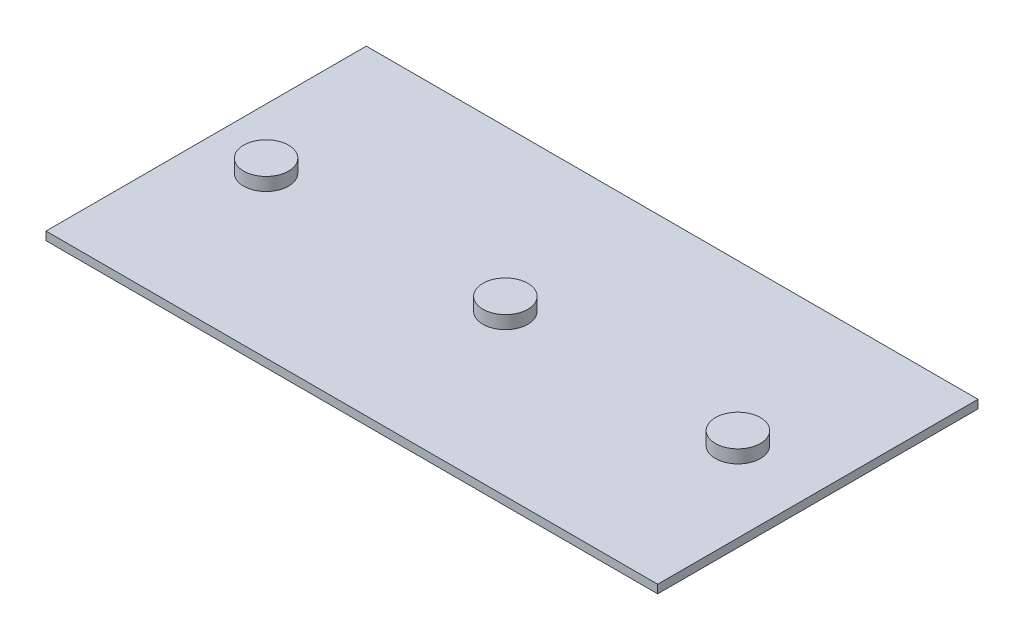
ISO-10303-21;
HEADER;
FILE_DESCRIPTION(('STEP AP214'),'2;1');
FILE_NAME('part.step','',(''),(''),'','','');
FILE_SCHEMA(('AUTOMOTIVE_DESIGN { 1 0 10303 214 1 1 1 1 }'));
ENDSEC;
DATA;
#1=APPLICATION_CONTEXT('core data for automotive mechanical design processes');
#2=APPLICATION_PROTOCOL_DEFINITION('international standard','automotive_design',2000,#1);
#3=PRODUCT_CONTEXT('',#1,'mechanical');
#4=PRODUCT('Part','Part','',(#3));
#5=PRODUCT_RELATED_PRODUCT_CATEGORY('part','',(#4));
#6=PRODUCT_DEFINITION_FORMATION('','',#4);
#7=PRODUCT_DEFINITION_CONTEXT('part definition',#1,'design');
#8=PRODUCT_DEFINITION('design','',#6,#7);
#9=PRODUCT_DEFINITION_SHAPE('','',#8);
#10=(LENGTH_UNIT() NAMED_UNIT(*) SI_UNIT(.MILLI.,.METRE.));
#11=(NAMED_UNIT(*) PLANE_ANGLE_UNIT() SI_UNIT($,.RADIAN.));
#12=(NAMED_UNIT(*) SI_UNIT($,.STERADIAN.) SOLID_ANGLE_UNIT());
#13=UNCERTAINTY_MEASURE_WITH_UNIT(LENGTH_MEASURE(1.E-05),#10,'distance_accuracy_value','');
#14=(GEOMETRIC_REPRESENTATION_CONTEXT(3) GLOBAL_UNCERTAINTY_ASSIGNED_CONTEXT((#13)) GLOBAL_UNIT_ASSIGNED_CONTEXT((#10,
#11,#12)) REPRESENTATION_CONTEXT('',''));
#15=CARTESIAN_POINT('',(0.,0.,0.));
#16=DIRECTION('',(0.,0.,1.));
#17=DIRECTION('',(1.,0.,0.));
#18=AXIS2_PLACEMENT_3D('',#15,#16,#17);
#19=CARTESIAN_POINT('',(0.,0.,0.));
#20=DIRECTION('',(0.,1.,0.));
#21=DIRECTION('',(0.,0.,1.));
#22=AXIS2_PLACEMENT_3D('',#19,#20,#21);
#23=PLANE('',#22);
#24=DIRECTION('',(0.,0.,1.));
#25=VECTOR('',#24,1.);
#26=CARTESIAN_POINT('',(0.,0.,0.));
#27=LINE('',#26,#25);
#28=CARTESIAN_POINT('',(0.,0.,0.));
#29=VERTEX_POINT('',#28);
#30=CARTESIAN_POINT('',(0.,0.,61.3));
#31=VERTEX_POINT('',#30);
#32=EDGE_CURVE('E135',#29,#31,#27,.T.);
#33=ORIENTED_EDGE('',*,*,#32,.F.);
#34=DIRECTION('',(-1.,0.,0.));
#35=VECTOR('',#34,1.);
#36=CARTESIAN_POINT('',(0.,0.,0.));
#37=LINE('',#36,#35);
#38=CARTESIAN_POINT('',(117.07,0.,0.));
#39=VERTEX_POINT('',#38);
#40=EDGE_CURVE('E153',#39,#29,#37,.T.);
#41=ORIENTED_EDGE('',*,*,#40,.F.);
#42=DIRECTION('',(0.,0.,-1.));
#43=VECTOR('',#42,1.);
#44=CARTESIAN_POINT('',(117.07,0.,0.));
#45=LINE('',#44,#43);
#46=CARTESIAN_POINT('',(117.07,0.,61.3));
#47=VERTEX_POINT('',#46);
#48=EDGE_CURVE('E165',#47,#39,#45,.T.);
#49=ORIENTED_EDGE('',*,*,#48,.F.);
#50=DIRECTION('',(1.,0.,0.));
#51=VECTOR('',#50,1.);
#52=CARTESIAN_POINT('',(0.,0.,61.3));
#53=LINE('',#52,#51);
#54=EDGE_CURVE('E142',#31,#47,#53,.T.);
#55=ORIENTED_EDGE('',*,*,#54,.F.);
#56=EDGE_LOOP('',(#33,#41,#49,#55));
#57=FACE_BOUND('',#56,.T.);
#58=DIRECTION('',(0.,0.,-1.));
#59=VECTOR('',#58,1.);
#60=CARTESIAN_POINT('',(94.07,0.,38.6));
#61=LINE('',#60,#59);
#62=CARTESIAN_POINT('',(94.07,0.,38.6));
#63=VERTEX_POINT('',#62);
#64=CARTESIAN_POINT('',(94.07,0.,23.));
#65=VERTEX_POINT('',#64);
#66=EDGE_CURVE('E133',#63,#65,#61,.T.);
#67=ORIENTED_EDGE('',*,*,#66,.F.);
#68=DIRECTION('',(-1.,0.,0.));
#69=VECTOR('',#68,1.);
#70=CARTESIAN_POINT('',(94.07,0.,38.6));
#71=LINE('',#70,#69);
#72=CARTESIAN_POINT('',(109.07,0.,38.6));
#73=VERTEX_POINT('',#72);
#74=EDGE_CURVE('E130',#73,#63,#71,.T.);
#75=ORIENTED_EDGE('',*,*,#74,.F.);
#76=DIRECTION('',(0.,0.,1.));
#77=VECTOR('',#76,1.);
#78=CARTESIAN_POINT('',(109.07,0.,38.6));
#79=LINE('',#78,#77);
#80=CARTESIAN_POINT('',(109.07,0.,23.));
#81=VERTEX_POINT('',#80);
#82=EDGE_CURVE('E66',#81,#73,#79,.T.);
#83=ORIENTED_EDGE('',*,*,#82,.F.);
#84=DIRECTION('',(1.,0.,0.));
#85=VECTOR('',#84,1.);
#86=CARTESIAN_POINT('',(94.07,0.,23.));
#87=LINE('',#86,#85);
#88=EDGE_CURVE('E61',#65,#81,#87,.T.);
#89=ORIENTED_EDGE('',*,*,#88,.F.);
#90=EDGE_LOOP('',(#67,#75,#83,#89));
#91=FACE_BOUND('',#90,.T.);
#92=ADVANCED_FACE('F45',(#57,#91),#23,.F.);
#93=CARTESIAN_POINT('',(0.,1.6,0.));
#94=DIRECTION('',(1.,0.,0.));
#95=DIRECTION('',(0.,0.,-1.));
#96=AXIS2_PLACEMENT_3D('',#93,#94,#95);
#97=PLANE('',#96);
#98=ORIENTED_EDGE('',*,*,#32,.T.);
#99=DIRECTION('',(0.,-1.,0.));
#100=VECTOR('',#99,1.);
#101=CARTESIAN_POINT('',(0.,1.6,61.3));
#102=LINE('',#101,#100);
#103=CARTESIAN_POINT('',(0.,1.6,61.3));
#104=VERTEX_POINT('',#103);
#105=EDGE_CURVE('E11',#104,#31,#102,.T.);
#106=ORIENTED_EDGE('',*,*,#105,.F.);
#107=DIRECTION('',(0.,0.,1.));
#108=VECTOR('',#107,1.);
#109=CARTESIAN_POINT('',(0.,1.6,0.));
#110=LINE('',#109,#108);
#111=CARTESIAN_POINT('',(0.,1.6,0.));
#112=VERTEX_POINT('',#111);
#113=EDGE_CURVE('E148',#112,#104,#110,.T.);
#114=ORIENTED_EDGE('',*,*,#113,.F.);
#115=DIRECTION('',(0.,-1.,0.));
#116=VECTOR('',#115,1.);
#117=CARTESIAN_POINT('',(0.,1.6,0.));
#118=LINE('',#117,#116);
#119=EDGE_CURVE('E161',#112,#29,#118,.T.);
#120=ORIENTED_EDGE('',*,*,#119,.T.);
#121=EDGE_LOOP('',(#98,#106,#114,#120));
#122=FACE_BOUND('',#121,.T.);
#123=ADVANCED_FACE('F47',(#122),#97,.F.);
#124=CARTESIAN_POINT('',(0.,1.6,61.3));
#125=DIRECTION('',(0.,0.,-1.));
#126=DIRECTION('',(-1.,0.,0.));
#127=AXIS2_PLACEMENT_3D('',#124,#125,#126);
#128=PLANE('',#127);
#129=ORIENTED_EDGE('',*,*,#54,.T.);
#130=DIRECTION('',(0.,-1.,0.));
#131=VECTOR('',#130,1.);
#132=CARTESIAN_POINT('',(117.07,1.6,61.3));
#133=LINE('',#132,#131);
#134=CARTESIAN_POINT('',(117.07,1.6,61.3));
#135=VERTEX_POINT('',#134);
#136=EDGE_CURVE('E54',#135,#47,#133,.T.);
#137=ORIENTED_EDGE('',*,*,#136,.F.);
#138=DIRECTION('',(1.,0.,0.));
#139=VECTOR('',#138,1.);
#140=CARTESIAN_POINT('',(0.,1.6,61.3));
#141=LINE('',#140,#139);
#142=EDGE_CURVE('E152',#104,#135,#141,.T.);
#143=ORIENTED_EDGE('',*,*,#142,.F.);
#144=ORIENTED_EDGE('',*,*,#105,.T.);
#145=EDGE_LOOP('',(#129,#137,#143,#144));
#146=FACE_BOUND('',#145,.T.);
#147=ADVANCED_FACE('F199',(#146),#128,.F.);
#148=CARTESIAN_POINT('',(117.07,1.6,0.));
#149=DIRECTION('',(-1.,0.,0.));
#150=DIRECTION('',(0.,0.,1.));
#151=AXIS2_PLACEMENT_3D('',#148,#149,#150);
#152=PLANE('',#151);
#153=ORIENTED_EDGE('',*,*,#48,.T.);
#154=DIRECTION('',(0.,-1.,0.));
#155=VECTOR('',#154,1.);
#156=CARTESIAN_POINT('',(117.07,1.6,0.));
#157=LINE('',#156,#155);
#158=CARTESIAN_POINT('',(117.07,1.6,0.));
#159=VERTEX_POINT('',#158);
#160=EDGE_CURVE('E173',#159,#39,#157,.T.);
#161=ORIENTED_EDGE('',*,*,#160,.F.);
#162=DIRECTION('',(0.,0.,-1.));
#163=VECTOR('',#162,1.);
#164=CARTESIAN_POINT('',(117.07,1.6,0.));
#165=LINE('',#164,#163);
#166=EDGE_CURVE('E156',#135,#159,#165,.T.);
#167=ORIENTED_EDGE('',*,*,#166,.F.);
#168=ORIENTED_EDGE('',*,*,#136,.T.);
#169=EDGE_LOOP('',(#153,#161,#167,#168));
#170=FACE_BOUND('',#169,.T.);
#171=ADVANCED_FACE('F184',(#170),#152,.F.);
#172=CARTESIAN_POINT('',(0.,1.6,0.));
#173=DIRECTION('',(0.,0.,1.));
#174=DIRECTION('',(1.,0.,0.));
#175=AXIS2_PLACEMENT_3D('',#172,#173,#174);
#176=PLANE('',#175);
#177=ORIENTED_EDGE('',*,*,#40,.T.);
#178=ORIENTED_EDGE('',*,*,#119,.F.);
#179=DIRECTION('',(-1.,0.,0.));
#180=VECTOR('',#179,1.);
#181=CARTESIAN_POINT('',(0.,1.6,0.));
#182=LINE('',#181,#180);
#183=EDGE_CURVE('E159',#159,#112,#182,.T.);
#184=ORIENTED_EDGE('',*,*,#183,.F.);
#185=ORIENTED_EDGE('',*,*,#160,.T.);
#186=EDGE_LOOP('',(#177,#178,#184,#185));
#187=FACE_BOUND('',#186,.T.);
#188=ADVANCED_FACE('F192',(#187),#176,.F.);
#189=CARTESIAN_POINT('',(0.,1.6,0.));
#190=DIRECTION('',(0.,1.,0.));
#191=DIRECTION('',(0.,0.,1.));
#192=AXIS2_PLACEMENT_3D('',#189,#190,#191);
#193=PLANE('',#192);
#194=CARTESIAN_POINT('',(11.47,1.6,30.65));
#195=DIRECTION('',(0.,1.,0.));
#196=DIRECTION('',(0.,0.,1.));
#197=AXIS2_PLACEMENT_3D('',#194,#195,#196);
#198=CIRCLE('',#197,4.3);
#199=CARTESIAN_POINT('',(11.47,1.6,34.95));
#200=VERTEX_POINT('',#199);
#201=EDGE_CURVE('E224',#200,#200,#198,.T.);
#202=ORIENTED_EDGE('',*,*,#201,.F.);
#203=EDGE_LOOP('',(#202));
#204=FACE_BOUND('',#203,.T.);
#205=CARTESIAN_POINT('',(57.27,1.6,30.65));
#206=DIRECTION('',(0.,1.,0.));
#207=DIRECTION('',(0.,0.,1.));
#208=AXIS2_PLACEMENT_3D('',#205,#206,#207);
#209=CIRCLE('',#208,4.3);
#210=CARTESIAN_POINT('',(57.27,1.6,34.95));
#211=VERTEX_POINT('',#210);
#212=EDGE_CURVE('E228',#211,#211,#209,.T.);
#213=ORIENTED_EDGE('',*,*,#212,.F.);
#214=EDGE_LOOP('',(#213));
#215=FACE_BOUND('',#214,.T.);
#216=CARTESIAN_POINT('',(101.77,1.6,30.65));
#217=DIRECTION('',(0.,1.,0.));
#218=DIRECTION('',(0.,0.,1.));
#219=AXIS2_PLACEMENT_3D('',#216,#217,#218);
#220=CIRCLE('',#219,4.3);
#221=CARTESIAN_POINT('',(101.77,1.6,34.95));
#222=VERTEX_POINT('',#221);
#223=EDGE_CURVE('E231',#222,#222,#220,.T.);
#224=ORIENTED_EDGE('',*,*,#223,.F.);
#225=EDGE_LOOP('',(#224));
#226=FACE_BOUND('',#225,.T.);
#227=ORIENTED_EDGE('',*,*,#113,.T.);
#228=ORIENTED_EDGE('',*,*,#142,.T.);
#229=ORIENTED_EDGE('',*,*,#166,.T.);
#230=ORIENTED_EDGE('',*,*,#183,.T.);
#231=EDGE_LOOP('',(#227,#228,#229,#230));
#232=FACE_BOUND('',#231,.T.);
#233=ADVANCED_FACE('F198',(#204,#215,#226,#232),#193,.T.);
#234=CARTESIAN_POINT('',(94.07,-4.,38.6));
#235=DIRECTION('',(1.,0.,0.));
#236=DIRECTION('',(0.,0.,-1.));
#237=AXIS2_PLACEMENT_3D('',#234,#235,#236);
#238=PLANE('',#237);
#239=ORIENTED_EDGE('',*,*,#66,.T.);
#240=DIRECTION('',(0.,1.,0.));
#241=VECTOR('',#240,1.);
#242=CARTESIAN_POINT('',(94.07,-4.,23.));
#243=LINE('',#242,#241);
#244=CARTESIAN_POINT('',(94.07,-4.,23.));
#245=VERTEX_POINT('',#244);
#246=EDGE_CURVE('E112',#245,#65,#243,.T.);
#247=ORIENTED_EDGE('',*,*,#246,.F.);
#248=DIRECTION('',(0.,0.,-1.));
#249=VECTOR('',#248,1.);
#250=CARTESIAN_POINT('',(94.07,-4.,38.6));
#251=LINE('',#250,#249);
#252=CARTESIAN_POINT('',(94.07,-4.,38.6));
#253=VERTEX_POINT('',#252);
#254=EDGE_CURVE('E120',#253,#245,#251,.T.);
#255=ORIENTED_EDGE('',*,*,#254,.F.);
#256=DIRECTION('',(0.,1.,0.));
#257=VECTOR('',#256,1.);
#258=CARTESIAN_POINT('',(94.07,-4.,38.6));
#259=LINE('',#258,#257);
#260=EDGE_CURVE('E250',#253,#63,#259,.T.);
#261=ORIENTED_EDGE('',*,*,#260,.T.);
#262=EDGE_LOOP('',(#239,#247,#255,#261));
#263=FACE_BOUND('',#262,.T.);
#264=ADVANCED_FACE('F132',(#263),#238,.F.);
#265=CARTESIAN_POINT('',(94.07,-4.,23.));
#266=DIRECTION('',(0.,0.,1.));
#267=DIRECTION('',(1.,0.,0.));
#268=AXIS2_PLACEMENT_3D('',#265,#266,#267);
#269=PLANE('',#268);
#270=ORIENTED_EDGE('',*,*,#88,.T.);
#271=DIRECTION('',(0.,1.,0.));
#272=VECTOR('',#271,1.);
#273=CARTESIAN_POINT('',(109.07,-4.,23.));
#274=LINE('',#273,#272);
#275=CARTESIAN_POINT('',(109.07,-4.,23.));
#276=VERTEX_POINT('',#275);
#277=EDGE_CURVE('E115',#276,#81,#274,.T.);
#278=ORIENTED_EDGE('',*,*,#277,.F.);
#279=DIRECTION('',(1.,0.,0.));
#280=VECTOR('',#279,1.);
#281=CARTESIAN_POINT('',(94.07,-4.,23.));
#282=LINE('',#281,#280);
#283=EDGE_CURVE('E108',#245,#276,#282,.T.);
#284=ORIENTED_EDGE('',*,*,#283,.F.);
#285=ORIENTED_EDGE('',*,*,#246,.T.);
#286=EDGE_LOOP('',(#270,#278,#284,#285));
#287=FACE_BOUND('',#286,.T.);
#288=ADVANCED_FACE('F110',(#287),#269,.F.);
#289=CARTESIAN_POINT('',(109.07,-4.,38.6));
#290=DIRECTION('',(-1.,0.,0.));
#291=DIRECTION('',(0.,0.,1.));
#292=AXIS2_PLACEMENT_3D('',#289,#290,#291);
#293=PLANE('',#292);
#294=ORIENTED_EDGE('',*,*,#82,.T.);
#295=DIRECTION('',(0.,1.,0.));
#296=VECTOR('',#295,1.);
#297=CARTESIAN_POINT('',(109.07,-4.,38.6));
#298=LINE('',#297,#296);
#299=CARTESIAN_POINT('',(109.07,-4.,38.6));
#300=VERTEX_POINT('',#299);
#301=EDGE_CURVE('E144',#300,#73,#298,.T.);
#302=ORIENTED_EDGE('',*,*,#301,.F.);
#303=DIRECTION('',(0.,0.,1.));
#304=VECTOR('',#303,1.);
#305=CARTESIAN_POINT('',(109.07,-4.,38.6));
#306=LINE('',#305,#304);
#307=EDGE_CURVE('E119',#276,#300,#306,.T.);
#308=ORIENTED_EDGE('',*,*,#307,.F.);
#309=ORIENTED_EDGE('',*,*,#277,.T.);
#310=EDGE_LOOP('',(#294,#302,#308,#309));
#311=FACE_BOUND('',#310,.T.);
#312=ADVANCED_FACE('F269',(#311),#293,.F.);
#313=CARTESIAN_POINT('',(94.07,-4.,38.6));
#314=DIRECTION('',(0.,0.,-1.));
#315=DIRECTION('',(-1.,0.,0.));
#316=AXIS2_PLACEMENT_3D('',#313,#314,#315);
#317=PLANE('',#316);
#318=ORIENTED_EDGE('',*,*,#74,.T.);
#319=ORIENTED_EDGE('',*,*,#260,.F.);
#320=DIRECTION('',(-1.,0.,0.));
#321=VECTOR('',#320,1.);
#322=CARTESIAN_POINT('',(94.07,-4.,38.6));
#323=LINE('',#322,#321);
#324=EDGE_CURVE('E125',#300,#253,#323,.T.);
#325=ORIENTED_EDGE('',*,*,#324,.F.);
#326=ORIENTED_EDGE('',*,*,#301,.T.);
#327=EDGE_LOOP('',(#318,#319,#325,#326));
#328=FACE_BOUND('',#327,.T.);
#329=ADVANCED_FACE('F267',(#328),#317,.F.);
#330=CARTESIAN_POINT('',(0.,-4.,0.));
#331=DIRECTION('',(0.,-1.,0.));
#332=DIRECTION('',(0.,0.,-1.));
#333=AXIS2_PLACEMENT_3D('',#330,#331,#332);
#334=PLANE('',#333);
#335=ORIENTED_EDGE('',*,*,#254,.T.);
#336=ORIENTED_EDGE('',*,*,#283,.T.);
#337=ORIENTED_EDGE('',*,*,#307,.T.);
#338=ORIENTED_EDGE('',*,*,#324,.T.);
#339=EDGE_LOOP('',(#335,#336,#337,#338));
#340=FACE_BOUND('',#339,.T.);
#341=ADVANCED_FACE('F123',(#340),#334,.T.);
#342=CARTESIAN_POINT('',(101.77,4.1,30.65));
#343=DIRECTION('',(0.,-1.,0.));
#344=DIRECTION('',(0.,0.,-1.));
#345=AXIS2_PLACEMENT_3D('',#342,#343,#344);
#346=CYLINDRICAL_SURFACE('',#345,4.3);
#347=CARTESIAN_POINT('',(101.77,4.1,30.65));
#348=DIRECTION('',(0.,1.,0.));
#349=DIRECTION('',(0.,0.,1.));
#350=AXIS2_PLACEMENT_3D('',#347,#348,#349);
#351=CIRCLE('',#350,4.3);
#352=CARTESIAN_POINT('',(101.77,4.1,34.95));
#353=VERTEX_POINT('',#352);
#354=EDGE_CURVE('E234',#353,#353,#351,.T.);
#355=ORIENTED_EDGE('',*,*,#354,.F.);
#356=EDGE_LOOP('',(#355));
#357=FACE_BOUND('',#356,.T.);
#358=ORIENTED_EDGE('',*,*,#223,.T.);
#359=EDGE_LOOP('',(#358));
#360=FACE_BOUND('',#359,.T.);
#361=ADVANCED_FACE('F281',(#357,#360),#346,.T.);
#362=CARTESIAN_POINT('',(101.77,4.1,30.65));
#363=DIRECTION('',(0.,1.,0.));
#364=DIRECTION('',(0.,0.,1.));
#365=AXIS2_PLACEMENT_3D('',#362,#363,#364);
#366=PLANE('',#365);
#367=ORIENTED_EDGE('',*,*,#354,.T.);
#368=EDGE_LOOP('',(#367));
#369=FACE_BOUND('',#368,.T.);
#370=ADVANCED_FACE('F284',(#369),#366,.T.);
#371=CARTESIAN_POINT('',(57.27,4.1,30.65));
#372=DIRECTION('',(0.,-1.,0.));
#373=DIRECTION('',(0.,0.,-1.));
#374=AXIS2_PLACEMENT_3D('',#371,#372,#373);
#375=CYLINDRICAL_SURFACE('',#374,4.3);
#376=CARTESIAN_POINT('',(57.27,4.1,30.65));
#377=DIRECTION('',(0.,1.,0.));
#378=DIRECTION('',(0.,0.,1.));
#379=AXIS2_PLACEMENT_3D('',#376,#377,#378);
#380=CIRCLE('',#379,4.3);
#381=CARTESIAN_POINT('',(57.27,4.1,34.95));
#382=VERTEX_POINT('',#381);
#383=EDGE_CURVE('E242',#382,#382,#380,.T.);
#384=ORIENTED_EDGE('',*,*,#383,.F.);
#385=EDGE_LOOP('',(#384));
#386=FACE_BOUND('',#385,.T.);
#387=ORIENTED_EDGE('',*,*,#212,.T.);
#388=EDGE_LOOP('',(#387));
#389=FACE_BOUND('',#388,.T.);
#390=ADVANCED_FACE('F288',(#386,#389),#375,.T.);
#391=CARTESIAN_POINT('',(57.27,4.1,30.65));
#392=DIRECTION('',(0.,1.,0.));
#393=DIRECTION('',(0.,0.,1.));
#394=AXIS2_PLACEMENT_3D('',#391,#392,#393);
#395=PLANE('',#394);
#396=ORIENTED_EDGE('',*,*,#383,.T.);
#397=EDGE_LOOP('',(#396));
#398=FACE_BOUND('',#397,.T.);
#399=ADVANCED_FACE('F290',(#398),#395,.T.);
#400=CARTESIAN_POINT('',(11.47,4.1,30.65));
#401=DIRECTION('',(0.,-1.,0.));
#402=DIRECTION('',(0.,0.,-1.));
#403=AXIS2_PLACEMENT_3D('',#400,#401,#402);
#404=CYLINDRICAL_SURFACE('',#403,4.3);
#405=CARTESIAN_POINT('',(11.47,4.1,30.65));
#406=DIRECTION('',(0.,1.,0.));
#407=DIRECTION('',(0.,0.,1.));
#408=AXIS2_PLACEMENT_3D('',#405,#406,#407);
#409=CIRCLE('',#408,4.3);
#410=CARTESIAN_POINT('',(11.47,4.1,34.95));
#411=VERTEX_POINT('',#410);
#412=EDGE_CURVE('E309',#411,#411,#409,.T.);
#413=ORIENTED_EDGE('',*,*,#412,.F.);
#414=EDGE_LOOP('',(#413));
#415=FACE_BOUND('',#414,.T.);
#416=ORIENTED_EDGE('',*,*,#201,.T.);
#417=EDGE_LOOP('',(#416));
#418=FACE_BOUND('',#417,.T.);
#419=ADVANCED_FACE('F293',(#415,#418),#404,.T.);
#420=CARTESIAN_POINT('',(11.47,4.1,30.65));
#421=DIRECTION('',(0.,1.,0.));
#422=DIRECTION('',(0.,0.,1.));
#423=AXIS2_PLACEMENT_3D('',#420,#421,#422);
#424=PLANE('',#423);
#425=ORIENTED_EDGE('',*,*,#412,.T.);
#426=EDGE_LOOP('',(#425));
#427=FACE_BOUND('',#426,.T.);
#428=ADVANCED_FACE('F298',(#427),#424,.T.);
#429=CLOSED_SHELL('',(#92,#123,#147,#171,#188,#233,#264,#288,#312,#329,#341,#361,#370,#390,#399,
#419,#428));
#430=MANIFOLD_SOLID_BREP('B2',#429);
#431=ADVANCED_BREP_SHAPE_REPRESENTATION('',(#18,#430),#14);
#432=SHAPE_DEFINITION_REPRESENTATION(#9,#431);
ENDSEC;
END-ISO-10303-21;
